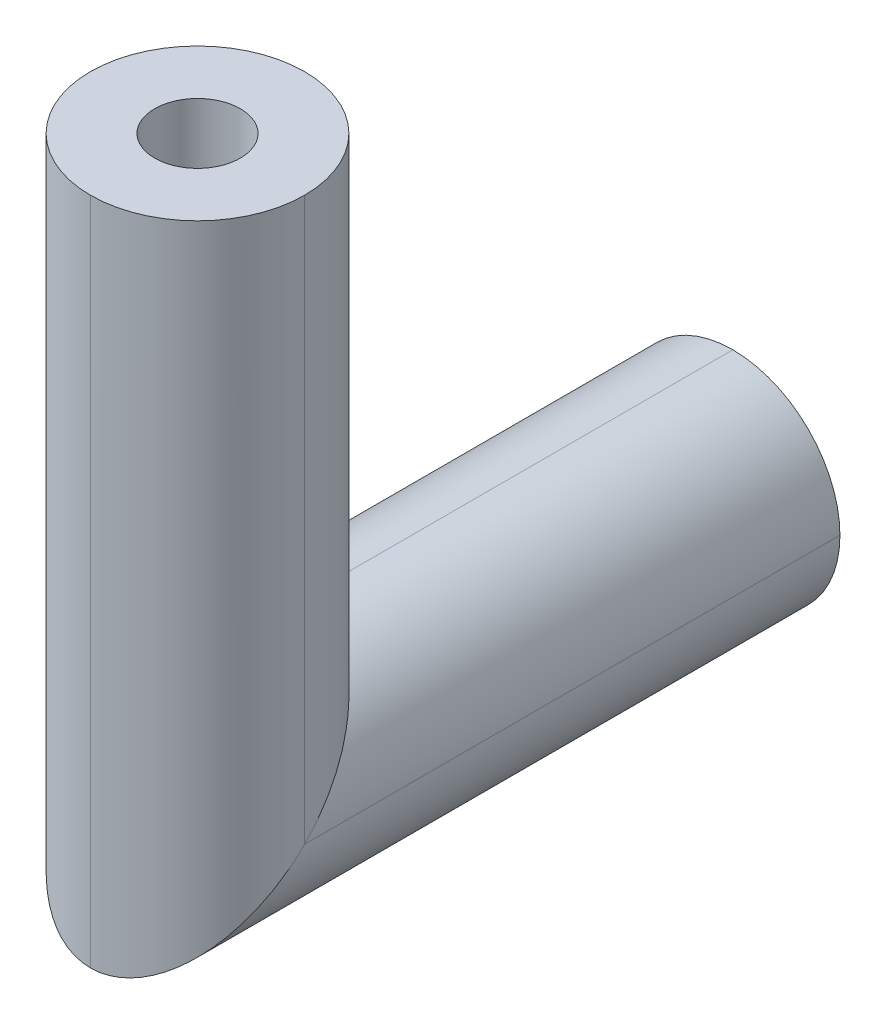
ISO-10303-21;
HEADER;
FILE_DESCRIPTION(('STEP AP214'),'2;1');
FILE_NAME('part.step','',(''),(''),'','','');
FILE_SCHEMA(('AUTOMOTIVE_DESIGN { 1 0 10303 214 1 1 1 1 }'));
ENDSEC;
DATA;
#1=APPLICATION_CONTEXT('core data for automotive mechanical design processes');
#2=APPLICATION_PROTOCOL_DEFINITION('international standard','automotive_design',2000,#1);
#3=PRODUCT_CONTEXT('',#1,'mechanical');
#4=PRODUCT('Part','Part','',(#3));
#5=PRODUCT_RELATED_PRODUCT_CATEGORY('part','',(#4));
#6=PRODUCT_DEFINITION_FORMATION('','',#4);
#7=PRODUCT_DEFINITION_CONTEXT('part definition',#1,'design');
#8=PRODUCT_DEFINITION('design','',#6,#7);
#9=PRODUCT_DEFINITION_SHAPE('','',#8);
#10=(LENGTH_UNIT() NAMED_UNIT(*) SI_UNIT(.MILLI.,.METRE.));
#11=(NAMED_UNIT(*) PLANE_ANGLE_UNIT() SI_UNIT($,.RADIAN.));
#12=(NAMED_UNIT(*) SI_UNIT($,.STERADIAN.) SOLID_ANGLE_UNIT());
#13=UNCERTAINTY_MEASURE_WITH_UNIT(LENGTH_MEASURE(1.E-05),#10,'distance_accuracy_value','');
#14=(GEOMETRIC_REPRESENTATION_CONTEXT(3) GLOBAL_UNCERTAINTY_ASSIGNED_CONTEXT((#13)) GLOBAL_UNIT_ASSIGNED_CONTEXT((#10,
#11,#12)) REPRESENTATION_CONTEXT('',''));
#15=CARTESIAN_POINT('',(0.,0.,0.));
#16=DIRECTION('',(0.,0.,1.));
#17=DIRECTION('',(1.,0.,0.));
#18=AXIS2_PLACEMENT_3D('',#15,#16,#17);
#19=CARTESIAN_POINT('',(4.,0.,-12.));
#20=DIRECTION('',(0.,0.,-1.));
#21=DIRECTION('',(0.,1.,0.));
#22=AXIS2_PLACEMENT_3D('',#19,#20,#21);
#23=PLANE('',#22);
#24=CARTESIAN_POINT('',(2.,1.99999999999997,-12.));
#25=DIRECTION('',(0.,0.,-1.));
#26=DIRECTION('',(0.,1.,0.));
#27=AXIS2_PLACEMENT_3D('',#24,#25,#26);
#28=CIRCLE('',#27,0.8);
#29=CARTESIAN_POINT('',(2.,2.79999999999997,-12.));
#30=VERTEX_POINT('',#29);
#31=EDGE_CURVE('E120',#30,#30,#28,.T.);
#32=ORIENTED_EDGE('',*,*,#31,.F.);
#33=EDGE_LOOP('',(#32));
#34=FACE_BOUND('',#33,.T.);
#35=CARTESIAN_POINT('',(2.,1.99999999999997,-12.));
#36=DIRECTION('',(0.,0.,-1.));
#37=DIRECTION('',(0.,1.,0.));
#38=AXIS2_PLACEMENT_3D('',#35,#36,#37);
#39=CIRCLE('',#38,2.);
#40=CARTESIAN_POINT('',(2.,3.99999999999997,-12.));
#41=VERTEX_POINT('',#40);
#42=CARTESIAN_POINT('',(4.,1.99999999999997,-12.));
#43=VERTEX_POINT('',#42);
#44=EDGE_CURVE('E114',#41,#43,#39,.T.);
#45=ORIENTED_EDGE('',*,*,#44,.T.);
#46=CARTESIAN_POINT('',(2.,1.99999999999997,-12.));
#47=DIRECTION('',(0.,0.,-1.));
#48=DIRECTION('',(0.,1.,0.));
#49=AXIS2_PLACEMENT_3D('',#46,#47,#48);
#50=CIRCLE('',#49,2.);
#51=CARTESIAN_POINT('',(2.,0.,-12.));
#52=VERTEX_POINT('',#51);
#53=EDGE_CURVE('E11',#43,#52,#50,.T.);
#54=ORIENTED_EDGE('',*,*,#53,.T.);
#55=CARTESIAN_POINT('',(2.,1.99999999999997,-12.));
#56=DIRECTION('',(0.,0.,-1.));
#57=DIRECTION('',(0.,1.,0.));
#58=AXIS2_PLACEMENT_3D('',#55,#56,#57);
#59=CIRCLE('',#58,2.);
#60=CARTESIAN_POINT('',(0.,1.99999999999997,-12.));
#61=VERTEX_POINT('',#60);
#62=EDGE_CURVE('E53',#52,#61,#59,.T.);
#63=ORIENTED_EDGE('',*,*,#62,.T.);
#64=CARTESIAN_POINT('',(2.,1.99999999999997,-12.));
#65=DIRECTION('',(0.,0.,-1.));
#66=DIRECTION('',(0.,1.,0.));
#67=AXIS2_PLACEMENT_3D('',#64,#65,#66);
#68=CIRCLE('',#67,2.);
#69=EDGE_CURVE('E113',#61,#41,#68,.T.);
#70=ORIENTED_EDGE('',*,*,#69,.T.);
#71=EDGE_LOOP('',(#45,#54,#63,#70));
#72=FACE_BOUND('',#71,.T.);
#73=ADVANCED_FACE('F43',(#34,#72),#23,.T.);
#74=CARTESIAN_POINT('',(4.,12.5,0.));
#75=DIRECTION('',(0.,1.,0.));
#76=DIRECTION('',(0.,0.,1.));
#77=AXIS2_PLACEMENT_3D('',#74,#75,#76);
#78=PLANE('',#77);
#79=CARTESIAN_POINT('',(2.,12.5,-2.));
#80=DIRECTION('',(0.,1.,0.));
#81=DIRECTION('',(0.,0.,1.));
#82=AXIS2_PLACEMENT_3D('',#79,#80,#81);
#83=CIRCLE('',#82,0.8);
#84=CARTESIAN_POINT('',(2.,12.5,-1.2));
#85=VERTEX_POINT('',#84);
#86=EDGE_CURVE('E251',#85,#85,#83,.T.);
#87=ORIENTED_EDGE('',*,*,#86,.F.);
#88=EDGE_LOOP('',(#87));
#89=FACE_BOUND('',#88,.T.);
#90=CARTESIAN_POINT('',(2.,12.5,-2.));
#91=DIRECTION('',(0.,1.,0.));
#92=DIRECTION('',(0.,0.,1.));
#93=AXIS2_PLACEMENT_3D('',#90,#91,#92);
#94=CIRCLE('',#93,2.);
#95=CARTESIAN_POINT('',(0.,12.5,-2.));
#96=VERTEX_POINT('',#95);
#97=CARTESIAN_POINT('',(2.,12.5,0.));
#98=VERTEX_POINT('',#97);
#99=EDGE_CURVE('E161',#96,#98,#94,.T.);
#100=ORIENTED_EDGE('',*,*,#99,.T.);
#101=CARTESIAN_POINT('',(2.,12.5,-2.));
#102=DIRECTION('',(0.,1.,0.));
#103=DIRECTION('',(0.,0.,1.));
#104=AXIS2_PLACEMENT_3D('',#101,#102,#103);
#105=CIRCLE('',#104,2.);
#106=CARTESIAN_POINT('',(4.,12.5,-2.));
#107=VERTEX_POINT('',#106);
#108=EDGE_CURVE('E173',#98,#107,#105,.T.);
#109=ORIENTED_EDGE('',*,*,#108,.T.);
#110=CARTESIAN_POINT('',(2.,12.5,-2.));
#111=DIRECTION('',(0.,1.,0.));
#112=DIRECTION('',(0.,0.,1.));
#113=AXIS2_PLACEMENT_3D('',#110,#111,#112);
#114=CIRCLE('',#113,2.);
#115=CARTESIAN_POINT('',(2.,12.5,-4.));
#116=VERTEX_POINT('',#115);
#117=EDGE_CURVE('E175',#107,#116,#114,.T.);
#118=ORIENTED_EDGE('',*,*,#117,.T.);
#119=CARTESIAN_POINT('',(2.,12.5,-2.));
#120=DIRECTION('',(0.,1.,0.));
#121=DIRECTION('',(0.,0.,1.));
#122=AXIS2_PLACEMENT_3D('',#119,#120,#121);
#123=CIRCLE('',#122,2.);
#124=EDGE_CURVE('E94',#116,#96,#123,.T.);
#125=ORIENTED_EDGE('',*,*,#124,.T.);
#126=EDGE_LOOP('',(#100,#109,#118,#125));
#127=FACE_BOUND('',#126,.T.);
#128=ADVANCED_FACE('F209',(#89,#127),#78,.T.);
#129=CARTESIAN_POINT('',(2.,4.5,-2.));
#130=DIRECTION('',(0.,1.,0.));
#131=DIRECTION('',(0.,0.,1.));
#132=AXIS2_PLACEMENT_3D('',#129,#130,#131);
#133=CYLINDRICAL_SURFACE('',#132,0.8);
#134=CARTESIAN_POINT('',(2.,4.5,-2.));
#135=DIRECTION('',(0.,1.,0.));
#136=DIRECTION('',(0.,0.,1.));
#137=AXIS2_PLACEMENT_3D('',#134,#135,#136);
#138=CIRCLE('',#137,0.8);
#139=CARTESIAN_POINT('',(2.,4.5,-1.2));
#140=VERTEX_POINT('',#139);
#141=EDGE_CURVE('E256',#140,#140,#138,.T.);
#142=ORIENTED_EDGE('',*,*,#141,.F.);
#143=EDGE_LOOP('',(#142));
#144=FACE_BOUND('',#143,.T.);
#145=ORIENTED_EDGE('',*,*,#86,.T.);
#146=EDGE_LOOP('',(#145));
#147=FACE_BOUND('',#146,.T.);
#148=ADVANCED_FACE('F205',(#144,#147),#133,.F.);
#149=CARTESIAN_POINT('',(2.,4.5,-2.));
#150=DIRECTION('',(0.,1.,0.));
#151=DIRECTION('',(0.,0.,1.));
#152=AXIS2_PLACEMENT_3D('',#149,#150,#151);
#153=PLANE('',#152);
#154=ORIENTED_EDGE('',*,*,#141,.T.);
#155=EDGE_LOOP('',(#154));
#156=FACE_BOUND('',#155,.T.);
#157=ADVANCED_FACE('F199',(#156),#153,.T.);
#158=CARTESIAN_POINT('',(2.,3.99999999999999,-2.00000000000001));
#159=DIRECTION('',(0.,-1.,0.));
#160=DIRECTION('',(0.,0.,-1.));
#161=AXIS2_PLACEMENT_3D('',#158,#159,#160);
#162=CYLINDRICAL_SURFACE('',#161,0.8);
#163=CARTESIAN_POINT('',(2.,3.99999999999999,-2.00000000000001));
#164=DIRECTION('',(0.,-1.,0.));
#165=DIRECTION('',(0.,0.,-1.));
#166=AXIS2_PLACEMENT_3D('',#163,#164,#165);
#167=CIRCLE('',#166,0.8);
#168=CARTESIAN_POINT('',(2.,3.99999999999999,-2.80000000000001));
#169=VERTEX_POINT('',#168);
#170=EDGE_CURVE('E248',#169,#169,#167,.T.);
#171=ORIENTED_EDGE('',*,*,#170,.F.);
#172=EDGE_LOOP('',(#171));
#173=FACE_BOUND('',#172,.T.);
#174=CARTESIAN_POINT('',(2.,0.,-1.2));
#175=CARTESIAN_POINT('',(1.97840168322957,-1.86161777589485E-06,-1.1999992532829));
#176=CARTESIAN_POINT('',(1.95681447558564,0.000350269845654495,-1.20087524275467));
#177=CARTESIAN_POINT('',(1.9138095059133,0.00174254682550976,-1.20436400848753));
#178=CARTESIAN_POINT('',(1.89239169559273,0.00278248853755035,-1.2069762702766));
#179=CARTESIAN_POINT('',(1.8287769837944,0.00689257694577087,-1.21736333075158));
#180=CARTESIAN_POINT('',(1.78703043070207,0.0109533376282405,-1.22768874463873));
#181=CARTESIAN_POINT('',(1.70603033135228,0.021300122787019,-1.25474326519283));
#182=CARTESIAN_POINT('',(1.66677512032182,0.0275846424316183,-1.27146804199153));
#183=CARTESIAN_POINT('',(1.59161223940858,0.0417651950573073,-1.31078349884292));
#184=CARTESIAN_POINT('',(1.55570699921835,0.0496623846525638,-1.33337839215367));
#185=CARTESIAN_POINT('',(1.48659686159004,0.0666769196882216,-1.38489567853297));
#186=CARTESIAN_POINT('',(1.45357122120173,0.0758318229271868,-1.41404590127484));
#187=CARTESIAN_POINT('',(1.39272712502946,0.0941587126501799,-1.47736378002305));
#188=CARTESIAN_POINT('',(1.3649106381838,0.103330704275624,-1.51153332454308));
#189=CARTESIAN_POINT('',(1.31404985936394,0.121108920482234,-1.58577160198075));
#190=CARTESIAN_POINT('',(1.29127354123091,0.129671704971957,-1.62603539234332));
#191=CARTESIAN_POINT('',(1.25289781776042,0.144665539592398,-1.7102154302886));
#192=CARTESIAN_POINT('',(1.23729486244593,0.151097643719701,-1.75412985849831));
#193=CARTESIAN_POINT('',(1.21444058278389,0.160694520611915,-1.84228448563516));
#194=CARTESIAN_POINT('',(1.20684256987398,0.163994250627383,-1.88641957589883));
#195=CARTESIAN_POINT('',(1.19913081968509,0.167343981989817,-1.97545306538498));
#196=CARTESIAN_POINT('',(1.19901355685806,0.167395514156073,-2.02035109506763));
#197=CARTESIAN_POINT('',(1.20600428078715,0.164357986492037,-2.10630302195284));
#198=CARTESIAN_POINT('',(1.21260998494545,0.161487250614815,-2.14740698645702));
#199=CARTESIAN_POINT('',(1.23202146827351,0.153295159109219,-2.22786449380811));
#200=CARTESIAN_POINT('',(1.24482822395874,0.14797341751324,-2.26721775989631));
#201=CARTESIAN_POINT('',(1.27652202144367,0.135362090359311,-2.34400694673059));
#202=CARTESIAN_POINT('',(1.29552784021721,0.128034553809568,-2.38138733276047));
#203=CARTESIAN_POINT('',(1.33899721232608,0.112247615385339,-2.45256600460473));
#204=CARTESIAN_POINT('',(1.36346286770606,0.103787778076925,-2.48636290335907));
#205=CARTESIAN_POINT('',(1.41937796030923,0.0858935895915848,-2.55216191170483));
#206=CARTESIAN_POINT('',(1.45122084728124,0.0764344369430022,-2.58382379179447));
#207=CARTESIAN_POINT('',(1.51987045495781,0.0581617170839075,-2.64147082242234));
#208=CARTESIAN_POINT('',(1.55667873245374,0.0493483536894881,-2.66745418586259));
#209=CARTESIAN_POINT('',(1.63518763229893,0.0331370475106517,-2.71345886540745));
#210=CARTESIAN_POINT('',(1.67697214974892,0.0257713387373262,-2.7333489626088));
#211=CARTESIAN_POINT('',(1.76364428661831,0.0135355319165717,-2.76568074033687));
#212=CARTESIAN_POINT('',(1.80852701585932,0.00866159868195067,-2.77813387237912));
#213=CARTESIAN_POINT('',(1.8782162101236,0.00356516187565393,-2.79105445563946));
#214=CARTESIAN_POINT('',(1.90244119125823,0.00223291958889645,-2.79440530370713));
#215=CARTESIAN_POINT('',(1.95110593175906,0.000449035603599556,-2.79887795898569));
#216=CARTESIAN_POINT('',(1.97554547885477,-3.39533922891469E-06,-2.80000176400693));
#217=CARTESIAN_POINT('',(2.,0.,-2.8));
#218=B_SPLINE_CURVE_WITH_KNOTS('',3,(#174,#175,#176,#177,#178,#179,#180,#181,#182,#183,#184,
#185,#186,#187,#188,#189,#190,#191,#192,#193,#194,#195,#196,#197,#198,#199,#200,#201,#202,#203,
#204,#205,#206,#207,#208,#209,#210,#211,#212,#213,#214,#215,#216,#217),.UNSPECIFIED.,.F.,.F.,(4,
2,2,2,2,2,2,2,2,2,2,2,2,2,2,2,2,2,2,2,2,4),(0.,0.0647526799260261,0.129486181639266,
0.258395674984036,0.387218100767083,0.516133245130554,0.65051918153479,0.784955810610359,
0.925384652578943,1.06574392366056,1.19973726465172,1.33366745643372,1.45827660352849,
1.58290537993168,1.71007812612753,1.8372999187355,1.97434772588188,2.11143860172117,
2.25130229661043,2.39095006889911,2.46432062809039,2.53762533901016),.UNSPECIFIED.);
#219=CARTESIAN_POINT('',(2.,0.,-1.2));
#220=VERTEX_POINT('',#219);
#221=CARTESIAN_POINT('',(2.,0.,-2.8));
#222=VERTEX_POINT('',#221);
#223=EDGE_CURVE('E174',#220,#222,#218,.T.);
#224=ORIENTED_EDGE('',*,*,#223,.T.);
#225=CARTESIAN_POINT('',(2.,0.,-2.8));
#226=CARTESIAN_POINT('',(2.02159831677043,-1.86161778139489E-06,-2.8000007467171));
#227=CARTESIAN_POINT('',(2.04318552441436,0.000350269845648966,-2.79912475724533));
#228=CARTESIAN_POINT('',(2.0861904940867,0.00174254682550427,-2.79563599151247));
#229=CARTESIAN_POINT('',(2.10760830440727,0.00278248853754495,-2.7930237297234));
#230=CARTESIAN_POINT('',(2.1712230162056,0.00689257694576577,-2.78263666924842));
#231=CARTESIAN_POINT('',(2.21296956929793,0.0109533376282357,-2.77231125536127));
#232=CARTESIAN_POINT('',(2.29396966864772,0.0213001227870144,-2.74525673480718));
#233=CARTESIAN_POINT('',(2.33322487967818,0.0275846424316137,-2.72853195800847));
#234=CARTESIAN_POINT('',(2.40838776059142,0.0417651950573027,-2.68921650115708));
#235=CARTESIAN_POINT('',(2.44429300078165,0.0496623846525593,-2.66662160784633));
#236=CARTESIAN_POINT('',(2.51340313840996,0.0666769196882176,-2.61510432146704));
#237=CARTESIAN_POINT('',(2.54642877879827,0.0758318229271832,-2.58595409872516));
#238=CARTESIAN_POINT('',(2.60727287497054,0.0941587126501768,-2.52263621997696));
#239=CARTESIAN_POINT('',(2.6350893618162,0.103330704275621,-2.48846667545693));
#240=CARTESIAN_POINT('',(2.68595014063606,0.121108920482231,-2.41422839801925));
#241=CARTESIAN_POINT('',(2.70872645876909,0.129671704971955,-2.37396460765669));
#242=CARTESIAN_POINT('',(2.74710218223958,0.144665539592397,-2.2897845697114));
#243=CARTESIAN_POINT('',(2.76270513755407,0.1510976437197,-2.2458701415017));
#244=CARTESIAN_POINT('',(2.78555941721611,0.160694520611914,-2.15771551436484));
#245=CARTESIAN_POINT('',(2.79315743012602,0.163994250627382,-2.11358042410118));
#246=CARTESIAN_POINT('',(2.80086918031491,0.167343981989817,-2.02454693461503));
#247=CARTESIAN_POINT('',(2.80098644314194,0.167395514156074,-1.97964890493238));
#248=CARTESIAN_POINT('',(2.79399571921285,0.164357986492038,-1.89369697804716));
#249=CARTESIAN_POINT('',(2.78739001505455,0.161487250614816,-1.85259301354298));
#250=CARTESIAN_POINT('',(2.76797853172649,0.153295159109221,-1.77213550619189));
#251=CARTESIAN_POINT('',(2.75517177604126,0.147973417513243,-1.73278224010369));
#252=CARTESIAN_POINT('',(2.72347797855633,0.135362090359313,-1.65599305326941));
#253=CARTESIAN_POINT('',(2.70447215978279,0.128034553809571,-1.61861266723954));
#254=CARTESIAN_POINT('',(2.66100278767393,0.112247615385343,-1.54743399539527));
#255=CARTESIAN_POINT('',(2.63653713229394,0.103787778076929,-1.51363709664094));
#256=CARTESIAN_POINT('',(2.58062203969077,0.0858935895915891,-1.44783808829517));
#257=CARTESIAN_POINT('',(2.54877915271876,0.0764344369430066,-1.41617620820553));
#258=CARTESIAN_POINT('',(2.48012954504219,0.0581617170839124,-1.35852917757767));
#259=CARTESIAN_POINT('',(2.44332126754626,0.0493483536894932,-1.33254581413741));
#260=CARTESIAN_POINT('',(2.36481236770107,0.0331370475106566,-1.28654113459255));
#261=CARTESIAN_POINT('',(2.32302785025109,0.0257713387373306,-1.2666510373912));
#262=CARTESIAN_POINT('',(2.23635571338169,0.0135355319165764,-1.23431925966314));
#263=CARTESIAN_POINT('',(2.19147298414069,0.00866159868195607,-1.22186612762088));
#264=CARTESIAN_POINT('',(2.1217837898764,0.00356516187565962,-1.20894554436054));
#265=CARTESIAN_POINT('',(2.09755880874177,0.00223291958890208,-1.20559469629288));
#266=CARTESIAN_POINT('',(2.04889406824094,0.000449035603605041,-1.20112204101431));
#267=CARTESIAN_POINT('',(2.02445452114523,-3.39533922350434E-06,-1.19999823599307));
#268=CARTESIAN_POINT('',(2.,0.,-1.2));
#269=B_SPLINE_CURVE_WITH_KNOTS('',3,(#225,#226,#227,#228,#229,#230,#231,#232,#233,#234,#235,
#236,#237,#238,#239,#240,#241,#242,#243,#244,#245,#246,#247,#248,#249,#250,#251,#252,#253,#254,
#255,#256,#257,#258,#259,#260,#261,#262,#263,#264,#265,#266,#267,#268),.UNSPECIFIED.,.F.,.F.,(4,
2,2,2,2,2,2,2,2,2,2,2,2,2,2,2,2,2,2,2,2,4),(0.,0.0647526799260257,0.129486181639265,
0.258395674984036,0.387218100767083,0.516133245130554,0.65051918153479,0.784955810610359,
0.925384652578942,1.06574392366057,1.19973726465172,1.33366745643372,1.45827660352849,
1.58290537993168,1.71007812612753,1.8372999187355,1.97434772588188,2.11143860172117,
2.25130229661044,2.39095006889911,2.46432062809039,2.53762533901017),.UNSPECIFIED.);
#270=EDGE_CURVE('E116',#222,#220,#269,.T.);
#271=ORIENTED_EDGE('',*,*,#270,.T.);
#272=EDGE_LOOP('',(#224,#271));
#273=FACE_BOUND('',#272,.T.);
#274=ADVANCED_FACE('F193',(#173,#273),#162,.F.);
#275=CARTESIAN_POINT('',(2.,3.99999999999999,-2.00000000000001));
#276=DIRECTION('',(0.,-1.,0.));
#277=DIRECTION('',(0.,0.,-1.));
#278=AXIS2_PLACEMENT_3D('',#275,#276,#277);
#279=PLANE('',#278);
#280=ORIENTED_EDGE('',*,*,#170,.T.);
#281=EDGE_LOOP('',(#280));
#282=FACE_BOUND('',#281,.T.);
#283=ADVANCED_FACE('F198',(#282),#279,.T.);
#284=CARTESIAN_POINT('',(2.,2.,-4.00000000000001));
#285=DIRECTION('',(0.,0.,-1.));
#286=DIRECTION('',(0.,1.,0.));
#287=AXIS2_PLACEMENT_3D('',#284,#285,#286);
#288=CYLINDRICAL_SURFACE('',#287,0.8);
#289=CARTESIAN_POINT('',(2.,2.,-4.00000000000001));
#290=DIRECTION('',(0.,0.,-1.));
#291=DIRECTION('',(0.,1.,0.));
#292=AXIS2_PLACEMENT_3D('',#289,#290,#291);
#293=CIRCLE('',#292,0.8);
#294=CARTESIAN_POINT('',(2.,2.8,-4.00000000000001));
#295=VERTEX_POINT('',#294);
#296=EDGE_CURVE('E247',#295,#295,#293,.T.);
#297=ORIENTED_EDGE('',*,*,#296,.F.);
#298=EDGE_LOOP('',(#297));
#299=FACE_BOUND('',#298,.T.);
#300=ORIENTED_EDGE('',*,*,#31,.T.);
#301=EDGE_LOOP('',(#300));
#302=FACE_BOUND('',#301,.T.);
#303=ADVANCED_FACE('F238',(#299,#302),#288,.F.);
#304=CARTESIAN_POINT('',(2.,2.,-4.00000000000001));
#305=DIRECTION('',(0.,0.,-1.));
#306=DIRECTION('',(0.,1.,0.));
#307=AXIS2_PLACEMENT_3D('',#304,#305,#306);
#308=PLANE('',#307);
#309=ORIENTED_EDGE('',*,*,#296,.T.);
#310=EDGE_LOOP('',(#309));
#311=FACE_BOUND('',#310,.T.);
#312=ADVANCED_FACE('F234',(#311),#308,.T.);
#313=CARTESIAN_POINT('',(2.,2.00000000000002,0.));
#314=DIRECTION('',(0.,0.,1.));
#315=DIRECTION('',(0.,-1.,0.));
#316=AXIS2_PLACEMENT_3D('',#313,#314,#315);
#317=CYLINDRICAL_SURFACE('',#316,2.);
#318=DIRECTION('',(0.,0.,-1.));
#319=VECTOR('',#318,1.);
#320=CARTESIAN_POINT('',(2.,4.,-4.));
#321=LINE('',#320,#319);
#322=CARTESIAN_POINT('',(2.,4.,-4.));
#323=VERTEX_POINT('',#322);
#324=EDGE_CURVE('E47',#41,#323,#321,.F.);
#325=ORIENTED_EDGE('',*,*,#324,.F.);
#326=ORIENTED_EDGE('',*,*,#69,.F.);
#327=DIRECTION('',(0.,0.,-1.));
#328=VECTOR('',#327,1.);
#329=CARTESIAN_POINT('',(0.,1.99999999999997,-12.));
#330=LINE('',#329,#328);
#331=CARTESIAN_POINT('',(0.,2.00000000000001,-2.));
#332=VERTEX_POINT('',#331);
#333=EDGE_CURVE('E80',#332,#61,#330,.T.);
#334=ORIENTED_EDGE('',*,*,#333,.F.);
#335=CARTESIAN_POINT('',(2.,2.00000000000001,-2.));
#336=DIRECTION('',(0.,0.707106781186549,0.707106781186546));
#337=DIRECTION('',(0.,0.707106781186546,-0.707106781186549));
#338=AXIS2_PLACEMENT_3D('',#335,#336,#337);
#339=ELLIPSE('',#338,2.82842712474619,2.);
#340=EDGE_CURVE('E118',#323,#332,#339,.T.);
#341=ORIENTED_EDGE('',*,*,#340,.F.);
#342=EDGE_LOOP('',(#325,#326,#334,#341));
#343=FACE_BOUND('',#342,.T.);
#344=ADVANCED_FACE('F45',(#343),#317,.T.);
#345=CARTESIAN_POINT('',(2.,2.00000000000002,0.));
#346=DIRECTION('',(0.,0.,-1.));
#347=DIRECTION('',(0.,1.,0.));
#348=AXIS2_PLACEMENT_3D('',#345,#346,#347);
#349=CYLINDRICAL_SURFACE('',#348,2.);
#350=ORIENTED_EDGE('',*,*,#44,.F.);
#351=ORIENTED_EDGE('',*,*,#324,.T.);
#352=CARTESIAN_POINT('',(2.,2.00000000000001,-2.));
#353=DIRECTION('',(0.,-0.707106781186549,-0.707106781186546));
#354=DIRECTION('',(0.,-0.707106781186546,0.707106781186549));
#355=AXIS2_PLACEMENT_3D('',#352,#353,#354);
#356=ELLIPSE('',#355,2.82842712474619,2.);
#357=CARTESIAN_POINT('',(4.,2.00000000000001,-2.));
#358=VERTEX_POINT('',#357);
#359=EDGE_CURVE('E146',#358,#323,#356,.F.);
#360=ORIENTED_EDGE('',*,*,#359,.F.);
#361=DIRECTION('',(0.,0.,-1.));
#362=VECTOR('',#361,1.);
#363=CARTESIAN_POINT('',(4.,2.00000000000002,0.));
#364=LINE('',#363,#362);
#365=EDGE_CURVE('E123',#43,#358,#364,.F.);
#366=ORIENTED_EDGE('',*,*,#365,.F.);
#367=EDGE_LOOP('',(#350,#351,#360,#366));
#368=FACE_BOUND('',#367,.T.);
#369=ADVANCED_FACE('F121',(#368),#349,.T.);
#370=CARTESIAN_POINT('',(2.,2.00000000000001,0.));
#371=DIRECTION('',(0.,0.,-1.));
#372=DIRECTION('',(0.,1.,0.));
#373=AXIS2_PLACEMENT_3D('',#370,#371,#372);
#374=CYLINDRICAL_SURFACE('',#373,2.);
#375=ORIENTED_EDGE('',*,*,#333,.T.);
#376=ORIENTED_EDGE('',*,*,#62,.F.);
#377=DIRECTION('',(0.,0.,1.));
#378=VECTOR('',#377,1.);
#379=CARTESIAN_POINT('',(2.,0.,-12.));
#380=LINE('',#379,#378);
#381=EDGE_CURVE('E62',#222,#52,#380,.F.);
#382=ORIENTED_EDGE('',*,*,#381,.F.);
#383=ORIENTED_EDGE('',*,*,#223,.F.);
#384=DIRECTION('',(0.,0.,1.));
#385=VECTOR('',#384,1.);
#386=CARTESIAN_POINT('',(2.,0.,-12.));
#387=LINE('',#386,#385);
#388=CARTESIAN_POINT('',(2.,0.,0.));
#389=VERTEX_POINT('',#388);
#390=EDGE_CURVE('E142',#389,#220,#387,.F.);
#391=ORIENTED_EDGE('',*,*,#390,.F.);
#392=CARTESIAN_POINT('',(2.,2.00000000000001,-2.));
#393=DIRECTION('',(0.,-0.707106781186549,-0.707106781186546));
#394=DIRECTION('',(0.,-0.707106781186546,0.707106781186549));
#395=AXIS2_PLACEMENT_3D('',#392,#393,#394);
#396=ELLIPSE('',#395,2.82842712474619,2.);
#397=EDGE_CURVE('E139',#332,#389,#396,.F.);
#398=ORIENTED_EDGE('',*,*,#397,.F.);
#399=EDGE_LOOP('',(#375,#376,#382,#383,#391,#398));
#400=FACE_BOUND('',#399,.T.);
#401=ADVANCED_FACE('F154',(#400),#374,.T.);
#402=CARTESIAN_POINT('',(2.,0.,-2.));
#403=DIRECTION('',(0.,1.,0.));
#404=DIRECTION('',(0.,0.,1.));
#405=AXIS2_PLACEMENT_3D('',#402,#403,#404);
#406=CYLINDRICAL_SURFACE('',#405,2.);
#407=DIRECTION('',(0.,1.,0.));
#408=VECTOR('',#407,1.);
#409=CARTESIAN_POINT('',(0.,0.,-2.));
#410=LINE('',#409,#408);
#411=EDGE_CURVE('E136',#96,#332,#410,.F.);
#412=ORIENTED_EDGE('',*,*,#411,.F.);
#413=ORIENTED_EDGE('',*,*,#124,.F.);
#414=DIRECTION('',(0.,1.,0.));
#415=VECTOR('',#414,1.);
#416=CARTESIAN_POINT('',(2.,0.,-4.));
#417=LINE('',#416,#415);
#418=EDGE_CURVE('E149',#323,#116,#417,.T.);
#419=ORIENTED_EDGE('',*,*,#418,.F.);
#420=ORIENTED_EDGE('',*,*,#340,.T.);
#421=EDGE_LOOP('',(#412,#413,#419,#420));
#422=FACE_BOUND('',#421,.T.);
#423=ADVANCED_FACE('F163',(#422),#406,.T.);
#424=CARTESIAN_POINT('',(2.,0.,-2.));
#425=DIRECTION('',(0.,-1.,0.));
#426=DIRECTION('',(0.,0.,-1.));
#427=AXIS2_PLACEMENT_3D('',#424,#425,#426);
#428=CYLINDRICAL_SURFACE('',#427,2.);
#429=ORIENTED_EDGE('',*,*,#418,.T.);
#430=ORIENTED_EDGE('',*,*,#117,.F.);
#431=DIRECTION('',(0.,1.,0.));
#432=VECTOR('',#431,1.);
#433=CARTESIAN_POINT('',(4.,12.5,-2.));
#434=LINE('',#433,#432);
#435=EDGE_CURVE('E134',#358,#107,#434,.T.);
#436=ORIENTED_EDGE('',*,*,#435,.F.);
#437=ORIENTED_EDGE('',*,*,#359,.T.);
#438=EDGE_LOOP('',(#429,#430,#436,#437));
#439=FACE_BOUND('',#438,.T.);
#440=ADVANCED_FACE('F167',(#439),#428,.T.);
#441=CARTESIAN_POINT('',(2.,2.00000000000001,0.));
#442=DIRECTION('',(0.,0.,1.));
#443=DIRECTION('',(0.,-1.,0.));
#444=AXIS2_PLACEMENT_3D('',#441,#442,#443);
#445=CYLINDRICAL_SURFACE('',#444,2.);
#446=ORIENTED_EDGE('',*,*,#53,.F.);
#447=ORIENTED_EDGE('',*,*,#365,.T.);
#448=CARTESIAN_POINT('',(2.,2.00000000000001,-2.));
#449=DIRECTION('',(0.,0.707106781186549,0.707106781186546));
#450=DIRECTION('',(0.,-0.707106781186546,0.707106781186549));
#451=AXIS2_PLACEMENT_3D('',#448,#449,#450);
#452=ELLIPSE('',#451,2.82842712474619,2.);
#453=EDGE_CURVE('E131',#389,#358,#452,.T.);
#454=ORIENTED_EDGE('',*,*,#453,.F.);
#455=ORIENTED_EDGE('',*,*,#390,.T.);
#456=ORIENTED_EDGE('',*,*,#270,.F.);
#457=ORIENTED_EDGE('',*,*,#381,.T.);
#458=EDGE_LOOP('',(#446,#447,#454,#455,#456,#457));
#459=FACE_BOUND('',#458,.T.);
#460=ADVANCED_FACE('F168',(#459),#445,.T.);
#461=CARTESIAN_POINT('',(2.,0.,-2.));
#462=DIRECTION('',(0.,-1.,0.));
#463=DIRECTION('',(0.,0.,-1.));
#464=AXIS2_PLACEMENT_3D('',#461,#462,#463);
#465=CYLINDRICAL_SURFACE('',#464,2.);
#466=ORIENTED_EDGE('',*,*,#411,.T.);
#467=ORIENTED_EDGE('',*,*,#397,.T.);
#468=DIRECTION('',(0.,1.,0.));
#469=VECTOR('',#468,1.);
#470=CARTESIAN_POINT('',(2.,0.,0.));
#471=LINE('',#470,#469);
#472=EDGE_CURVE('E128',#98,#389,#471,.F.);
#473=ORIENTED_EDGE('',*,*,#472,.F.);
#474=ORIENTED_EDGE('',*,*,#99,.F.);
#475=EDGE_LOOP('',(#466,#467,#473,#474));
#476=FACE_BOUND('',#475,.T.);
#477=ADVANCED_FACE('F160',(#476),#465,.T.);
#478=CARTESIAN_POINT('',(2.,0.,-2.));
#479=DIRECTION('',(0.,1.,0.));
#480=DIRECTION('',(0.,0.,1.));
#481=AXIS2_PLACEMENT_3D('',#478,#479,#480);
#482=CYLINDRICAL_SURFACE('',#481,2.);
#483=ORIENTED_EDGE('',*,*,#453,.T.);
#484=ORIENTED_EDGE('',*,*,#435,.T.);
#485=ORIENTED_EDGE('',*,*,#108,.F.);
#486=ORIENTED_EDGE('',*,*,#472,.T.);
#487=EDGE_LOOP('',(#483,#484,#485,#486));
#488=FACE_BOUND('',#487,.T.);
#489=ADVANCED_FACE('F171',(#488),#482,.T.);
#490=CLOSED_SHELL('',(#73,#128,#148,#157,#274,#283,#303,#312,#344,#369,#401,#423,#440,#460,#477,#489));
#491=MANIFOLD_SOLID_BREP('B2',#490);
#492=ADVANCED_BREP_SHAPE_REPRESENTATION('',(#18,#491),#14);
#493=SHAPE_DEFINITION_REPRESENTATION(#9,#492);
ENDSEC;
END-ISO-10303-21;
